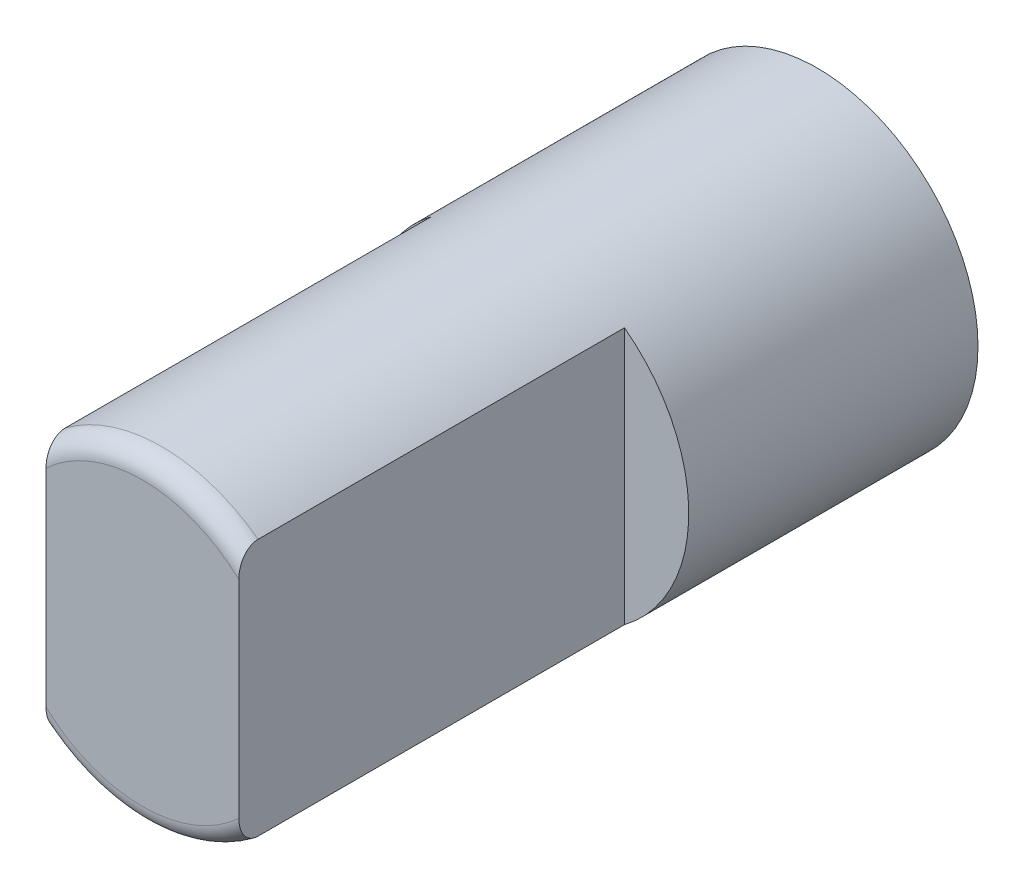
ISO-10303-21;
HEADER;
FILE_DESCRIPTION(('STEP AP214'),'2;1');
FILE_NAME('part.step','',(''),(''),'','','');
FILE_SCHEMA(('AUTOMOTIVE_DESIGN { 1 0 10303 214 1 1 1 1 }'));
ENDSEC;
DATA;
#1=APPLICATION_CONTEXT('core data for automotive mechanical design processes');
#2=APPLICATION_PROTOCOL_DEFINITION('international standard','automotive_design',2000,#1);
#3=PRODUCT_CONTEXT('',#1,'mechanical');
#4=PRODUCT('Part','Part','',(#3));
#5=PRODUCT_RELATED_PRODUCT_CATEGORY('part','',(#4));
#6=PRODUCT_DEFINITION_FORMATION('','',#4);
#7=PRODUCT_DEFINITION_CONTEXT('part definition',#1,'design');
#8=PRODUCT_DEFINITION('design','',#6,#7);
#9=PRODUCT_DEFINITION_SHAPE('','',#8);
#10=(LENGTH_UNIT() NAMED_UNIT(*) SI_UNIT(.MILLI.,.METRE.));
#11=(NAMED_UNIT(*) PLANE_ANGLE_UNIT() SI_UNIT($,.RADIAN.));
#12=(NAMED_UNIT(*) SI_UNIT($,.STERADIAN.) SOLID_ANGLE_UNIT());
#13=UNCERTAINTY_MEASURE_WITH_UNIT(LENGTH_MEASURE(1.E-05),#10,'distance_accuracy_value','');
#14=(GEOMETRIC_REPRESENTATION_CONTEXT(3) GLOBAL_UNCERTAINTY_ASSIGNED_CONTEXT((#13)) GLOBAL_UNIT_ASSIGNED_CONTEXT((#10,
#11,#12)) REPRESENTATION_CONTEXT('',''));
#15=CARTESIAN_POINT('',(0.,0.,0.));
#16=DIRECTION('',(0.,0.,1.));
#17=DIRECTION('',(1.,0.,0.));
#18=AXIS2_PLACEMENT_3D('',#15,#16,#17);
#19=CARTESIAN_POINT('',(0.,0.,10.5));
#20=DIRECTION('',(0.,0.,-1.));
#21=DIRECTION('',(-1.,0.,0.));
#22=AXIS2_PLACEMENT_3D('',#19,#20,#21);
#23=CYLINDRICAL_SURFACE('',#22,2.5);
#24=DIRECTION('',(0.,0.,1.));
#25=VECTOR('',#24,1.);
#26=CARTESIAN_POINT('',(-1.5,2.,4.5));
#27=LINE('',#26,#25);
#28=CARTESIAN_POINT('',(-1.5,2.,4.5));
#29=VERTEX_POINT('',#28);
#30=CARTESIAN_POINT('',(-1.5,2.,10.2));
#31=VERTEX_POINT('',#30);
#32=EDGE_CURVE('E115',#29,#31,#27,.T.);
#33=ORIENTED_EDGE('',*,*,#32,.T.);
#34=CARTESIAN_POINT('',(0.,0.,10.2));
#35=DIRECTION('',(0.,0.,1.));
#36=DIRECTION('',(1.,0.,0.));
#37=AXIS2_PLACEMENT_3D('',#34,#35,#36);
#38=CIRCLE('',#37,2.5);
#39=CARTESIAN_POINT('',(1.5,2.,10.2));
#40=VERTEX_POINT('',#39);
#41=EDGE_CURVE('E59',#31,#40,#38,.F.);
#42=ORIENTED_EDGE('',*,*,#41,.T.);
#43=DIRECTION('',(0.,0.,1.));
#44=VECTOR('',#43,1.);
#45=CARTESIAN_POINT('',(1.5,2.,4.5));
#46=LINE('',#45,#44);
#47=CARTESIAN_POINT('',(1.5,2.,4.5));
#48=VERTEX_POINT('',#47);
#49=EDGE_CURVE('E97',#48,#40,#46,.T.);
#50=ORIENTED_EDGE('',*,*,#49,.F.);
#51=CARTESIAN_POINT('',(0.,0.,4.5));
#52=DIRECTION('',(0.,0.,1.));
#53=DIRECTION('',(1.,0.,0.));
#54=AXIS2_PLACEMENT_3D('',#51,#52,#53);
#55=CIRCLE('',#54,2.5);
#56=CARTESIAN_POINT('',(1.5,-2.,4.5));
#57=VERTEX_POINT('',#56);
#58=EDGE_CURVE('E90',#57,#48,#55,.T.);
#59=ORIENTED_EDGE('',*,*,#58,.F.);
#60=DIRECTION('',(0.,0.,1.));
#61=VECTOR('',#60,1.);
#62=CARTESIAN_POINT('',(1.5,-2.,4.5));
#63=LINE('',#62,#61);
#64=CARTESIAN_POINT('',(1.5,-2.,10.2));
#65=VERTEX_POINT('',#64);
#66=EDGE_CURVE('E99',#57,#65,#63,.T.);
#67=ORIENTED_EDGE('',*,*,#66,.T.);
#68=CARTESIAN_POINT('',(0.,0.,10.2));
#69=DIRECTION('',(0.,0.,1.));
#70=DIRECTION('',(1.,0.,0.));
#71=AXIS2_PLACEMENT_3D('',#68,#69,#70);
#72=CIRCLE('',#71,2.5);
#73=CARTESIAN_POINT('',(-1.5,-2.,10.2));
#74=VERTEX_POINT('',#73);
#75=EDGE_CURVE('E173',#65,#74,#72,.F.);
#76=ORIENTED_EDGE('',*,*,#75,.T.);
#77=DIRECTION('',(0.,0.,1.));
#78=VECTOR('',#77,1.);
#79=CARTESIAN_POINT('',(-1.5,-2.,4.5));
#80=LINE('',#79,#78);
#81=CARTESIAN_POINT('',(-1.5,-2.,4.5));
#82=VERTEX_POINT('',#81);
#83=EDGE_CURVE('E112',#82,#74,#80,.T.);
#84=ORIENTED_EDGE('',*,*,#83,.F.);
#85=CARTESIAN_POINT('',(0.,0.,4.5));
#86=DIRECTION('',(0.,0.,1.));
#87=DIRECTION('',(1.,0.,0.));
#88=AXIS2_PLACEMENT_3D('',#85,#86,#87);
#89=CIRCLE('',#88,2.5);
#90=EDGE_CURVE('E107',#29,#82,#89,.T.);
#91=ORIENTED_EDGE('',*,*,#90,.F.);
#92=EDGE_LOOP('',(#33,#42,#50,#59,#67,#76,#84,#91));
#93=FACE_BOUND('',#92,.T.);
#94=CARTESIAN_POINT('',(0.,0.,0.));
#95=DIRECTION('',(0.,0.,1.));
#96=DIRECTION('',(1.,0.,0.));
#97=AXIS2_PLACEMENT_3D('',#94,#95,#96);
#98=CIRCLE('',#97,2.5);
#99=CARTESIAN_POINT('',(2.5,0.,0.));
#100=VERTEX_POINT('',#99);
#101=EDGE_CURVE('E117',#100,#100,#98,.T.);
#102=ORIENTED_EDGE('',*,*,#101,.T.);
#103=EDGE_LOOP('',(#102));
#104=FACE_BOUND('',#103,.T.);
#105=ADVANCED_FACE('F32',(#93,#104),#23,.T.);
#106=CARTESIAN_POINT('',(0.,0.,10.5));
#107=DIRECTION('',(0.,0.,1.));
#108=DIRECTION('',(1.,0.,0.));
#109=AXIS2_PLACEMENT_3D('',#106,#107,#108);
#110=PLANE('',#109);
#111=DIRECTION('',(0.,-1.,0.));
#112=VECTOR('',#111,1.);
#113=CARTESIAN_POINT('',(1.5,2.,10.5));
#114=LINE('',#113,#112);
#115=CARTESIAN_POINT('',(1.5,1.60934769394311,10.5));
#116=VERTEX_POINT('',#115);
#117=CARTESIAN_POINT('',(1.5,-1.60934769394311,10.5));
#118=VERTEX_POINT('',#117);
#119=EDGE_CURVE('E94',#116,#118,#114,.T.);
#120=ORIENTED_EDGE('',*,*,#119,.F.);
#121=CARTESIAN_POINT('',(0.,0.,10.5));
#122=DIRECTION('',(0.,0.,1.));
#123=DIRECTION('',(1.,0.,0.));
#124=AXIS2_PLACEMENT_3D('',#121,#122,#123);
#125=CIRCLE('',#124,2.2);
#126=CARTESIAN_POINT('',(-1.5,1.60934769394311,10.5));
#127=VERTEX_POINT('',#126);
#128=EDGE_CURVE('E125',#116,#127,#125,.T.);
#129=ORIENTED_EDGE('',*,*,#128,.T.);
#130=DIRECTION('',(0.,1.,0.));
#131=VECTOR('',#130,1.);
#132=CARTESIAN_POINT('',(-1.5,-2.,10.5));
#133=LINE('',#132,#131);
#134=CARTESIAN_POINT('',(-1.5,-1.60934769394311,10.5));
#135=VERTEX_POINT('',#134);
#136=EDGE_CURVE('E103',#135,#127,#133,.T.);
#137=ORIENTED_EDGE('',*,*,#136,.F.);
#138=CARTESIAN_POINT('',(0.,0.,10.5));
#139=DIRECTION('',(0.,0.,1.));
#140=DIRECTION('',(1.,0.,0.));
#141=AXIS2_PLACEMENT_3D('',#138,#139,#140);
#142=CIRCLE('',#141,2.2);
#143=EDGE_CURVE('E122',#135,#118,#142,.T.);
#144=ORIENTED_EDGE('',*,*,#143,.T.);
#145=EDGE_LOOP('',(#120,#129,#137,#144));
#146=FACE_BOUND('',#145,.T.);
#147=ADVANCED_FACE('F147',(#146),#110,.T.);
#148=CARTESIAN_POINT('',(0.,0.,0.));
#149=DIRECTION('',(0.,0.,1.));
#150=DIRECTION('',(1.,0.,0.));
#151=AXIS2_PLACEMENT_3D('',#148,#149,#150);
#152=PLANE('',#151);
#153=ORIENTED_EDGE('',*,*,#101,.F.);
#154=EDGE_LOOP('',(#153));
#155=FACE_BOUND('',#154,.T.);
#156=ADVANCED_FACE('F145',(#155),#152,.F.);
#157=CARTESIAN_POINT('',(-1.5,-2.,4.5));
#158=DIRECTION('',(1.,0.,0.));
#159=DIRECTION('',(0.,0.,-1.));
#160=AXIS2_PLACEMENT_3D('',#157,#158,#159);
#161=PLANE('',#160);
#162=ORIENTED_EDGE('',*,*,#136,.T.);
#163=CARTESIAN_POINT('',(-1.5,1.60934769394311,10.5));
#164=CARTESIAN_POINT('',(-1.5,1.63455756088802,10.4999930365524));
#165=CARTESIAN_POINT('',(-1.5,1.65983567369953,10.4982965539345));
#166=CARTESIAN_POINT('',(-1.5,1.71006444420656,10.4911978020638));
#167=CARTESIAN_POINT('',(-1.5,1.73501082564339,10.485765800347));
#168=CARTESIAN_POINT('',(-1.5,1.78015920378003,10.4719391103205));
#169=CARTESIAN_POINT('',(-1.5,1.80052499490785,10.4640875692299));
#170=CARTESIAN_POINT('',(-1.5,1.83971397031135,10.4452521364515));
#171=CARTESIAN_POINT('',(-1.5,1.85854156598494,10.4342776383488));
#172=CARTESIAN_POINT('',(-1.5,1.89041710668386,10.4115782676907));
#173=CARTESIAN_POINT('',(-1.5,1.90387281174314,10.4004275954057));
#174=CARTESIAN_POINT('',(-1.5,1.92879524167868,10.3760722511314));
#175=CARTESIAN_POINT('',(-1.5,1.94026321503409,10.3628688783869));
#176=CARTESIAN_POINT('',(-1.5,1.95908459464518,10.3367361609004));
#177=CARTESIAN_POINT('',(-1.5,1.96679780893242,10.3240664290926));
#178=CARTESIAN_POINT('',(-1.5,1.98000101437779,10.2976250572571));
#179=CARTESIAN_POINT('',(-1.5,1.98549441608471,10.2838551468498));
#180=CARTESIAN_POINT('',(-1.5,1.99309951243727,10.2584335740684));
#181=CARTESIAN_POINT('',(-1.5,1.99567095993214,10.2469182805731));
#182=CARTESIAN_POINT('',(-1.5,1.99912887456355,10.2236061892701));
#183=CARTESIAN_POINT('',(-1.5,2.00001067938499,10.2118087032326));
#184=CARTESIAN_POINT('',(-1.5,2.,10.2));
#185=B_SPLINE_CURVE_WITH_KNOTS('',3,(#163,#164,#165,#166,#167,#168,#169,#170,#171,#172,#173,
#174,#175,#176,#177,#178,#179,#180,#181,#182,#183,#184),.UNSPECIFIED.,.F.,.F.,(4,2,2,2,2,2,2,2,
2,2,4),(0.,0.0756831664616083,0.151975804988488,0.217216943562001,0.282263879933907,
0.334490581993891,0.386684361045045,0.43099770793193,0.475242709959179,0.510519640253401,
0.545893772543511),.UNSPECIFIED.);
#186=EDGE_CURVE('E134',#127,#31,#185,.T.);
#187=ORIENTED_EDGE('',*,*,#186,.T.);
#188=ORIENTED_EDGE('',*,*,#32,.F.);
#189=DIRECTION('',(0.,1.,0.));
#190=VECTOR('',#189,1.);
#191=CARTESIAN_POINT('',(-1.5,-2.,4.5));
#192=LINE('',#191,#190);
#193=EDGE_CURVE('E109',#82,#29,#192,.T.);
#194=ORIENTED_EDGE('',*,*,#193,.F.);
#195=ORIENTED_EDGE('',*,*,#83,.T.);
#196=CARTESIAN_POINT('',(-1.5,-2.,10.2));
#197=CARTESIAN_POINT('',(-1.5,-2.00002517455878,10.2144056996334));
#198=CARTESIAN_POINT('',(-1.5,-1.99870486599517,10.2287902734827));
#199=CARTESIAN_POINT('',(-1.5,-1.99358070321942,10.2570308291312));
#200=CARTESIAN_POINT('',(-1.5,-1.98979069108125,10.2708893041524));
#201=CARTESIAN_POINT('',(-1.5,-1.97993698735774,10.2977426754332));
#202=CARTESIAN_POINT('',(-1.5,-1.97387630854318,10.3107386892477));
#203=CARTESIAN_POINT('',(-1.5,-1.95978432211314,10.3356228880546));
#204=CARTESIAN_POINT('',(-1.5,-1.9517507082177,10.3475097538949));
#205=CARTESIAN_POINT('',(-1.5,-1.93348662795761,10.3706924605465));
#206=CARTESIAN_POINT('',(-1.5,-1.92314966060003,10.381903914782));
#207=CARTESIAN_POINT('',(-1.5,-1.90101243976691,10.4027555610775));
#208=CARTESIAN_POINT('',(-1.5,-1.88921201923138,10.4123955734589));
#209=CARTESIAN_POINT('',(-1.5,-1.85874706020155,10.4341885855466));
#210=CARTESIAN_POINT('',(-1.5,-1.83943396820596,10.4454387541662));
#211=CARTESIAN_POINT('',(-1.5,-1.79919162836747,10.4646739873788));
#212=CARTESIAN_POINT('',(-1.5,-1.77825631616834,10.4726460208116));
#213=CARTESIAN_POINT('',(-1.5,-1.73288707269971,10.486260588626));
#214=CARTESIAN_POINT('',(-1.5,-1.70833590606525,10.4915056696061));
#215=CARTESIAN_POINT('',(-1.5,-1.65894868973323,10.4983557383456));
#216=CARTESIAN_POINT('',(-1.5,-1.63411722198948,10.4999932051289));
#217=CARTESIAN_POINT('',(-1.5,-1.60934769394311,10.5));
#218=B_SPLINE_CURVE_WITH_KNOTS('',3,(#196,#197,#198,#199,#200,#201,#202,#203,#204,#205,#206,
#207,#208,#209,#210,#211,#212,#213,#214,#215,#216,#217),.UNSPECIFIED.,.F.,.F.,(4,2,2,2,2,2,2,2,
2,2,4),(0.,0.0431233888911273,0.086007136978675,0.128834186314012,0.171711539014381,
0.217289611231089,0.262872891194265,0.329559981731445,0.396509660474081,0.471542406056419,
0.545896829848013),.UNSPECIFIED.);
#219=EDGE_CURVE('E128',#74,#135,#218,.T.);
#220=ORIENTED_EDGE('',*,*,#219,.T.);
#221=EDGE_LOOP('',(#162,#187,#188,#194,#195,#220));
#222=FACE_BOUND('',#221,.T.);
#223=ADVANCED_FACE('F139',(#222),#161,.F.);
#224=CARTESIAN_POINT('',(0.,0.,4.5));
#225=DIRECTION('',(0.,0.,1.));
#226=DIRECTION('',(1.,0.,0.));
#227=AXIS2_PLACEMENT_3D('',#224,#225,#226);
#228=PLANE('',#227);
#229=ORIENTED_EDGE('',*,*,#90,.T.);
#230=ORIENTED_EDGE('',*,*,#193,.T.);
#231=EDGE_LOOP('',(#229,#230));
#232=FACE_BOUND('',#231,.T.);
#233=ADVANCED_FACE('F144',(#232),#228,.T.);
#234=CARTESIAN_POINT('',(1.5,2.,4.5));
#235=DIRECTION('',(-1.,0.,0.));
#236=DIRECTION('',(0.,0.,1.));
#237=AXIS2_PLACEMENT_3D('',#234,#235,#236);
#238=PLANE('',#237);
#239=ORIENTED_EDGE('',*,*,#49,.T.);
#240=CARTESIAN_POINT('',(1.5,2.,10.2));
#241=CARTESIAN_POINT('',(1.5,2.00002517455878,10.2144056996334));
#242=CARTESIAN_POINT('',(1.5,1.99870486599517,10.2287902734827));
#243=CARTESIAN_POINT('',(1.5,1.99358070321942,10.2570308291312));
#244=CARTESIAN_POINT('',(1.5,1.98979069108125,10.2708893041524));
#245=CARTESIAN_POINT('',(1.5,1.97993698735774,10.2977426754332));
#246=CARTESIAN_POINT('',(1.5,1.97387630854318,10.3107386892477));
#247=CARTESIAN_POINT('',(1.5,1.95978432211314,10.3356228880546));
#248=CARTESIAN_POINT('',(1.5,1.9517507082177,10.3475097538949));
#249=CARTESIAN_POINT('',(1.5,1.93348662795761,10.3706924605465));
#250=CARTESIAN_POINT('',(1.5,1.92314966060003,10.381903914782));
#251=CARTESIAN_POINT('',(1.5,1.90101243976691,10.4027555610775));
#252=CARTESIAN_POINT('',(1.5,1.88921201923138,10.4123955734589));
#253=CARTESIAN_POINT('',(1.5,1.85874706020155,10.4341885855466));
#254=CARTESIAN_POINT('',(1.5,1.83943396820596,10.4454387541662));
#255=CARTESIAN_POINT('',(1.5,1.79919162836747,10.4646739873788));
#256=CARTESIAN_POINT('',(1.5,1.77825631616834,10.4726460208116));
#257=CARTESIAN_POINT('',(1.5,1.73288707269971,10.486260588626));
#258=CARTESIAN_POINT('',(1.5,1.70833590606525,10.4915056696061));
#259=CARTESIAN_POINT('',(1.5,1.65894868973323,10.4983557383456));
#260=CARTESIAN_POINT('',(1.5,1.63411722198948,10.4999932051289));
#261=CARTESIAN_POINT('',(1.5,1.60934769394311,10.5));
#262=B_SPLINE_CURVE_WITH_KNOTS('',3,(#240,#241,#242,#243,#244,#245,#246,#247,#248,#249,#250,
#251,#252,#253,#254,#255,#256,#257,#258,#259,#260,#261),.UNSPECIFIED.,.F.,.F.,(4,2,2,2,2,2,2,2,
2,2,4),(0.,0.0431233888911273,0.086007136978675,0.128834186314012,0.171711539014381,
0.217289611231089,0.262872891194265,0.329559981731445,0.396509660474081,0.471542406056419,
0.545896829848013),.UNSPECIFIED.);
#263=EDGE_CURVE('E11',#40,#116,#262,.T.);
#264=ORIENTED_EDGE('',*,*,#263,.T.);
#265=ORIENTED_EDGE('',*,*,#119,.T.);
#266=CARTESIAN_POINT('',(1.5,-1.60934769394311,10.5));
#267=CARTESIAN_POINT('',(1.5,-1.63455756088802,10.4999930365524));
#268=CARTESIAN_POINT('',(1.5,-1.65983567369953,10.4982965539345));
#269=CARTESIAN_POINT('',(1.5,-1.71006444420656,10.4911978020638));
#270=CARTESIAN_POINT('',(1.5,-1.73501082564339,10.485765800347));
#271=CARTESIAN_POINT('',(1.5,-1.78015920378003,10.4719391103205));
#272=CARTESIAN_POINT('',(1.5,-1.80052499490785,10.4640875692299));
#273=CARTESIAN_POINT('',(1.5,-1.83971397031135,10.4452521364515));
#274=CARTESIAN_POINT('',(1.5,-1.85854156598494,10.4342776383488));
#275=CARTESIAN_POINT('',(1.5,-1.89041710668386,10.4115782676907));
#276=CARTESIAN_POINT('',(1.5,-1.90387281174314,10.4004275954057));
#277=CARTESIAN_POINT('',(1.5,-1.92879524167868,10.3760722511314));
#278=CARTESIAN_POINT('',(1.5,-1.94026321503409,10.3628688783869));
#279=CARTESIAN_POINT('',(1.5,-1.95908459464518,10.3367361609004));
#280=CARTESIAN_POINT('',(1.5,-1.96679780893242,10.3240664290926));
#281=CARTESIAN_POINT('',(1.5,-1.98000101437779,10.2976250572571));
#282=CARTESIAN_POINT('',(1.5,-1.98549441608471,10.2838551468498));
#283=CARTESIAN_POINT('',(1.5,-1.99309951243727,10.2584335740684));
#284=CARTESIAN_POINT('',(1.5,-1.99567095993214,10.2469182805731));
#285=CARTESIAN_POINT('',(1.5,-1.99912887456355,10.2236061892701));
#286=CARTESIAN_POINT('',(1.5,-2.00001067938499,10.2118087032326));
#287=CARTESIAN_POINT('',(1.5,-2.,10.2));
#288=B_SPLINE_CURVE_WITH_KNOTS('',3,(#266,#267,#268,#269,#270,#271,#272,#273,#274,#275,#276,
#277,#278,#279,#280,#281,#282,#283,#284,#285,#286,#287),.UNSPECIFIED.,.F.,.F.,(4,2,2,2,2,2,2,2,
2,2,4),(0.,0.0756831664616083,0.151975804988488,0.217216943562001,0.282263879933907,
0.334490581993891,0.386684361045045,0.43099770793193,0.475242709959179,0.510519640253401,
0.545893772543511),.UNSPECIFIED.);
#289=EDGE_CURVE('E45',#118,#65,#288,.T.);
#290=ORIENTED_EDGE('',*,*,#289,.T.);
#291=ORIENTED_EDGE('',*,*,#66,.F.);
#292=DIRECTION('',(0.,-1.,0.));
#293=VECTOR('',#292,1.);
#294=CARTESIAN_POINT('',(1.5,2.,4.5));
#295=LINE('',#294,#293);
#296=EDGE_CURVE('E93',#48,#57,#295,.T.);
#297=ORIENTED_EDGE('',*,*,#296,.F.);
#298=EDGE_LOOP('',(#239,#264,#265,#290,#291,#297));
#299=FACE_BOUND('',#298,.T.);
#300=ADVANCED_FACE('F96',(#299),#238,.F.);
#301=CARTESIAN_POINT('',(0.,0.,4.5));
#302=DIRECTION('',(0.,0.,1.));
#303=DIRECTION('',(1.,0.,0.));
#304=AXIS2_PLACEMENT_3D('',#301,#302,#303);
#305=PLANE('',#304);
#306=ORIENTED_EDGE('',*,*,#58,.T.);
#307=ORIENTED_EDGE('',*,*,#296,.T.);
#308=EDGE_LOOP('',(#306,#307));
#309=FACE_BOUND('',#308,.T.);
#310=ADVANCED_FACE('F92',(#309),#305,.T.);
#311=CARTESIAN_POINT('',(0.,0.,10.2));
#312=DIRECTION('',(0.,0.,1.));
#313=DIRECTION('',(1.,0.,0.));
#314=AXIS2_PLACEMENT_3D('',#311,#312,#313);
#315=TOROIDAL_SURFACE('',#314,2.2,0.3);
#316=ORIENTED_EDGE('',*,*,#263,.F.);
#317=ORIENTED_EDGE('',*,*,#41,.F.);
#318=ORIENTED_EDGE('',*,*,#186,.F.);
#319=ORIENTED_EDGE('',*,*,#128,.F.);
#320=EDGE_LOOP('',(#316,#317,#318,#319));
#321=FACE_BOUND('',#320,.T.);
#322=ADVANCED_FACE('F156',(#321),#315,.T.);
#323=CARTESIAN_POINT('',(0.,0.,10.2));
#324=DIRECTION('',(0.,0.,1.));
#325=DIRECTION('',(1.,0.,0.));
#326=AXIS2_PLACEMENT_3D('',#323,#324,#325);
#327=TOROIDAL_SURFACE('',#326,2.2,0.3);
#328=ORIENTED_EDGE('',*,*,#219,.F.);
#329=ORIENTED_EDGE('',*,*,#75,.F.);
#330=ORIENTED_EDGE('',*,*,#289,.F.);
#331=ORIENTED_EDGE('',*,*,#143,.F.);
#332=EDGE_LOOP('',(#328,#329,#330,#331));
#333=FACE_BOUND('',#332,.T.);
#334=ADVANCED_FACE('F34',(#333),#327,.T.);
#335=CLOSED_SHELL('',(#105,#147,#156,#223,#233,#300,#310,#322,#334));
#336=MANIFOLD_SOLID_BREP('B2',#335);
#337=ADVANCED_BREP_SHAPE_REPRESENTATION('',(#18,#336),#14);
#338=SHAPE_DEFINITION_REPRESENTATION(#9,#337);
ENDSEC;
END-ISO-10303-21;
